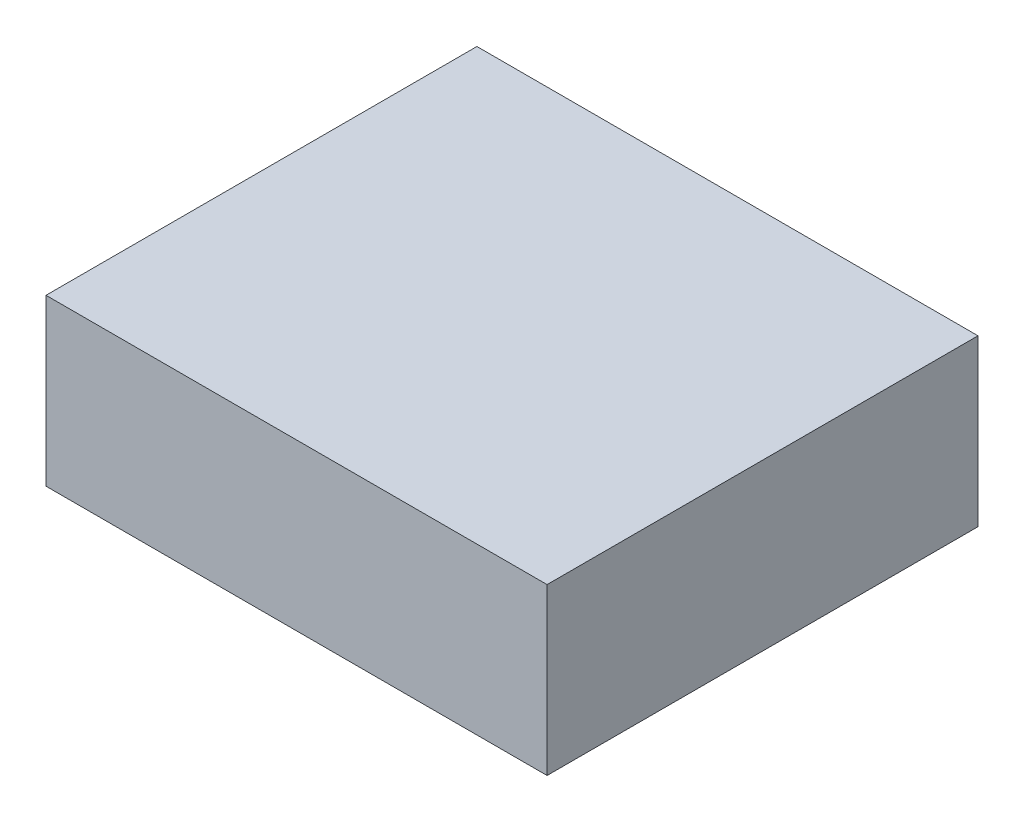
ISO-10303-21;
HEADER;
FILE_DESCRIPTION(('STEP AP214'),'2;1');
FILE_NAME('part.step','',(''),(''),'','','');
FILE_SCHEMA(('AUTOMOTIVE_DESIGN { 1 0 10303 214 1 1 1 1 }'));
ENDSEC;
DATA;
#1=APPLICATION_CONTEXT('core data for automotive mechanical design processes');
#2=APPLICATION_PROTOCOL_DEFINITION('international standard','automotive_design',2000,#1);
#3=PRODUCT_CONTEXT('',#1,'mechanical');
#4=PRODUCT('Part','Part','',(#3));
#5=PRODUCT_RELATED_PRODUCT_CATEGORY('part','',(#4));
#6=PRODUCT_DEFINITION_FORMATION('','',#4);
#7=PRODUCT_DEFINITION_CONTEXT('part definition',#1,'design');
#8=PRODUCT_DEFINITION('design','',#6,#7);
#9=PRODUCT_DEFINITION_SHAPE('','',#8);
#10=(LENGTH_UNIT() NAMED_UNIT(*) SI_UNIT(.MILLI.,.METRE.));
#11=(NAMED_UNIT(*) PLANE_ANGLE_UNIT() SI_UNIT($,.RADIAN.));
#12=(NAMED_UNIT(*) SI_UNIT($,.STERADIAN.) SOLID_ANGLE_UNIT());
#13=UNCERTAINTY_MEASURE_WITH_UNIT(LENGTH_MEASURE(1.E-05),#10,'distance_accuracy_value','');
#14=(GEOMETRIC_REPRESENTATION_CONTEXT(3) GLOBAL_UNCERTAINTY_ASSIGNED_CONTEXT((#13)) GLOBAL_UNIT_ASSIGNED_CONTEXT((#10,
#11,#12)) REPRESENTATION_CONTEXT('',''));
#15=CARTESIAN_POINT('',(0.,0.,0.));
#16=DIRECTION('',(0.,0.,1.));
#17=DIRECTION('',(1.,0.,0.));
#18=AXIS2_PLACEMENT_3D('',#15,#16,#17);
#19=CARTESIAN_POINT('',(0.,33.,0.));
#20=DIRECTION('',(1.,0.,0.));
#21=DIRECTION('',(0.,0.,-1.));
#22=AXIS2_PLACEMENT_3D('',#19,#20,#21);
#23=PLANE('',#22);
#24=DIRECTION('',(0.,0.,1.));
#25=VECTOR('',#24,1.);
#26=CARTESIAN_POINT('',(0.,0.,0.));
#27=LINE('',#26,#25);
#28=CARTESIAN_POINT('',(0.,0.,0.));
#29=VERTEX_POINT('',#28);
#30=CARTESIAN_POINT('',(0.,0.,86.));
#31=VERTEX_POINT('',#30);
#32=EDGE_CURVE('E104',#29,#31,#27,.T.);
#33=ORIENTED_EDGE('',*,*,#32,.T.);
#34=DIRECTION('',(0.,-1.,0.));
#35=VECTOR('',#34,1.);
#36=CARTESIAN_POINT('',(0.,33.,86.));
#37=LINE('',#36,#35);
#38=CARTESIAN_POINT('',(0.,33.,86.));
#39=VERTEX_POINT('',#38);
#40=EDGE_CURVE('E11',#39,#31,#37,.T.);
#41=ORIENTED_EDGE('',*,*,#40,.F.);
#42=DIRECTION('',(0.,0.,1.));
#43=VECTOR('',#42,1.);
#44=CARTESIAN_POINT('',(0.,33.,0.));
#45=LINE('',#44,#43);
#46=CARTESIAN_POINT('',(0.,33.,0.));
#47=VERTEX_POINT('',#46);
#48=EDGE_CURVE('E92',#47,#39,#45,.T.);
#49=ORIENTED_EDGE('',*,*,#48,.F.);
#50=DIRECTION('',(0.,-1.,0.));
#51=VECTOR('',#50,1.);
#52=CARTESIAN_POINT('',(0.,33.,0.));
#53=LINE('',#52,#51);
#54=EDGE_CURVE('E100',#47,#29,#53,.T.);
#55=ORIENTED_EDGE('',*,*,#54,.T.);
#56=EDGE_LOOP('',(#33,#41,#49,#55));
#57=FACE_BOUND('',#56,.T.);
#58=ADVANCED_FACE('F41',(#57),#23,.F.);
#59=CARTESIAN_POINT('',(0.,33.,86.));
#60=DIRECTION('',(0.,0.,-1.));
#61=DIRECTION('',(-1.,0.,0.));
#62=AXIS2_PLACEMENT_3D('',#59,#60,#61);
#63=PLANE('',#62);
#64=DIRECTION('',(1.,0.,0.));
#65=VECTOR('',#64,1.);
#66=CARTESIAN_POINT('',(0.,0.,86.));
#67=LINE('',#66,#65);
#68=CARTESIAN_POINT('',(100.,0.,86.));
#69=VERTEX_POINT('',#68);
#70=EDGE_CURVE('E96',#31,#69,#67,.T.);
#71=ORIENTED_EDGE('',*,*,#70,.T.);
#72=DIRECTION('',(0.,-1.,0.));
#73=VECTOR('',#72,1.);
#74=CARTESIAN_POINT('',(100.,33.,86.));
#75=LINE('',#74,#73);
#76=CARTESIAN_POINT('',(100.,33.,86.));
#77=VERTEX_POINT('',#76);
#78=EDGE_CURVE('E49',#77,#69,#75,.T.);
#79=ORIENTED_EDGE('',*,*,#78,.F.);
#80=DIRECTION('',(1.,0.,0.));
#81=VECTOR('',#80,1.);
#82=CARTESIAN_POINT('',(0.,33.,86.));
#83=LINE('',#82,#81);
#84=EDGE_CURVE('E87',#39,#77,#83,.T.);
#85=ORIENTED_EDGE('',*,*,#84,.F.);
#86=ORIENTED_EDGE('',*,*,#40,.T.);
#87=EDGE_LOOP('',(#71,#79,#85,#86));
#88=FACE_BOUND('',#87,.T.);
#89=ADVANCED_FACE('F95',(#88),#63,.F.);
#90=CARTESIAN_POINT('',(100.,33.,0.));
#91=DIRECTION('',(-1.,0.,0.));
#92=DIRECTION('',(0.,0.,1.));
#93=AXIS2_PLACEMENT_3D('',#90,#91,#92);
#94=PLANE('',#93);
#95=DIRECTION('',(0.,0.,-1.));
#96=VECTOR('',#95,1.);
#97=CARTESIAN_POINT('',(100.,0.,0.));
#98=LINE('',#97,#96);
#99=CARTESIAN_POINT('',(100.,0.,0.));
#100=VERTEX_POINT('',#99);
#101=EDGE_CURVE('E74',#69,#100,#98,.T.);
#102=ORIENTED_EDGE('',*,*,#101,.T.);
#103=DIRECTION('',(0.,-1.,0.));
#104=VECTOR('',#103,1.);
#105=CARTESIAN_POINT('',(100.,33.,0.));
#106=LINE('',#105,#104);
#107=CARTESIAN_POINT('',(100.,33.,0.));
#108=VERTEX_POINT('',#107);
#109=EDGE_CURVE('E97',#108,#100,#106,.T.);
#110=ORIENTED_EDGE('',*,*,#109,.F.);
#111=DIRECTION('',(0.,0.,-1.));
#112=VECTOR('',#111,1.);
#113=CARTESIAN_POINT('',(100.,33.,0.));
#114=LINE('',#113,#112);
#115=EDGE_CURVE('E90',#77,#108,#114,.T.);
#116=ORIENTED_EDGE('',*,*,#115,.F.);
#117=ORIENTED_EDGE('',*,*,#78,.T.);
#118=EDGE_LOOP('',(#102,#110,#116,#117));
#119=FACE_BOUND('',#118,.T.);
#120=ADVANCED_FACE('F98',(#119),#94,.F.);
#121=CARTESIAN_POINT('',(0.,33.,0.));
#122=DIRECTION('',(0.,0.,1.));
#123=DIRECTION('',(1.,0.,0.));
#124=AXIS2_PLACEMENT_3D('',#121,#122,#123);
#125=PLANE('',#124);
#126=DIRECTION('',(-1.,0.,0.));
#127=VECTOR('',#126,1.);
#128=CARTESIAN_POINT('',(0.,0.,0.));
#129=LINE('',#128,#127);
#130=EDGE_CURVE('E80',#100,#29,#129,.T.);
#131=ORIENTED_EDGE('',*,*,#130,.T.);
#132=ORIENTED_EDGE('',*,*,#54,.F.);
#133=DIRECTION('',(-1.,0.,0.));
#134=VECTOR('',#133,1.);
#135=CARTESIAN_POINT('',(0.,33.,0.));
#136=LINE('',#135,#134);
#137=EDGE_CURVE('E57',#108,#47,#136,.T.);
#138=ORIENTED_EDGE('',*,*,#137,.F.);
#139=ORIENTED_EDGE('',*,*,#109,.T.);
#140=EDGE_LOOP('',(#131,#132,#138,#139));
#141=FACE_BOUND('',#140,.T.);
#142=ADVANCED_FACE('F111',(#141),#125,.F.);
#143=CARTESIAN_POINT('',(0.,33.,0.));
#144=DIRECTION('',(0.,1.,0.));
#145=DIRECTION('',(0.,0.,1.));
#146=AXIS2_PLACEMENT_3D('',#143,#144,#145);
#147=PLANE('',#146);
#148=ORIENTED_EDGE('',*,*,#48,.T.);
#149=ORIENTED_EDGE('',*,*,#84,.T.);
#150=ORIENTED_EDGE('',*,*,#115,.T.);
#151=ORIENTED_EDGE('',*,*,#137,.T.);
#152=EDGE_LOOP('',(#148,#149,#150,#151));
#153=FACE_BOUND('',#152,.T.);
#154=ADVANCED_FACE('F88',(#153),#147,.T.);
#155=CARTESIAN_POINT('',(0.,0.,0.));
#156=DIRECTION('',(0.,1.,0.));
#157=DIRECTION('',(0.,0.,1.));
#158=AXIS2_PLACEMENT_3D('',#155,#156,#157);
#159=PLANE('',#158);
#160=ORIENTED_EDGE('',*,*,#32,.F.);
#161=ORIENTED_EDGE('',*,*,#130,.F.);
#162=ORIENTED_EDGE('',*,*,#101,.F.);
#163=ORIENTED_EDGE('',*,*,#70,.F.);
#164=EDGE_LOOP('',(#160,#161,#162,#163));
#165=FACE_BOUND('',#164,.T.);
#166=ADVANCED_FACE('F114',(#165),#159,.F.);
#167=CLOSED_SHELL('',(#58,#89,#120,#142,#154,#166));
#168=MANIFOLD_SOLID_BREP('B2',#167);
#169=ADVANCED_BREP_SHAPE_REPRESENTATION('',(#18,#168),#14);
#170=SHAPE_DEFINITION_REPRESENTATION(#9,#169);
ENDSEC;
END-ISO-10303-21;
